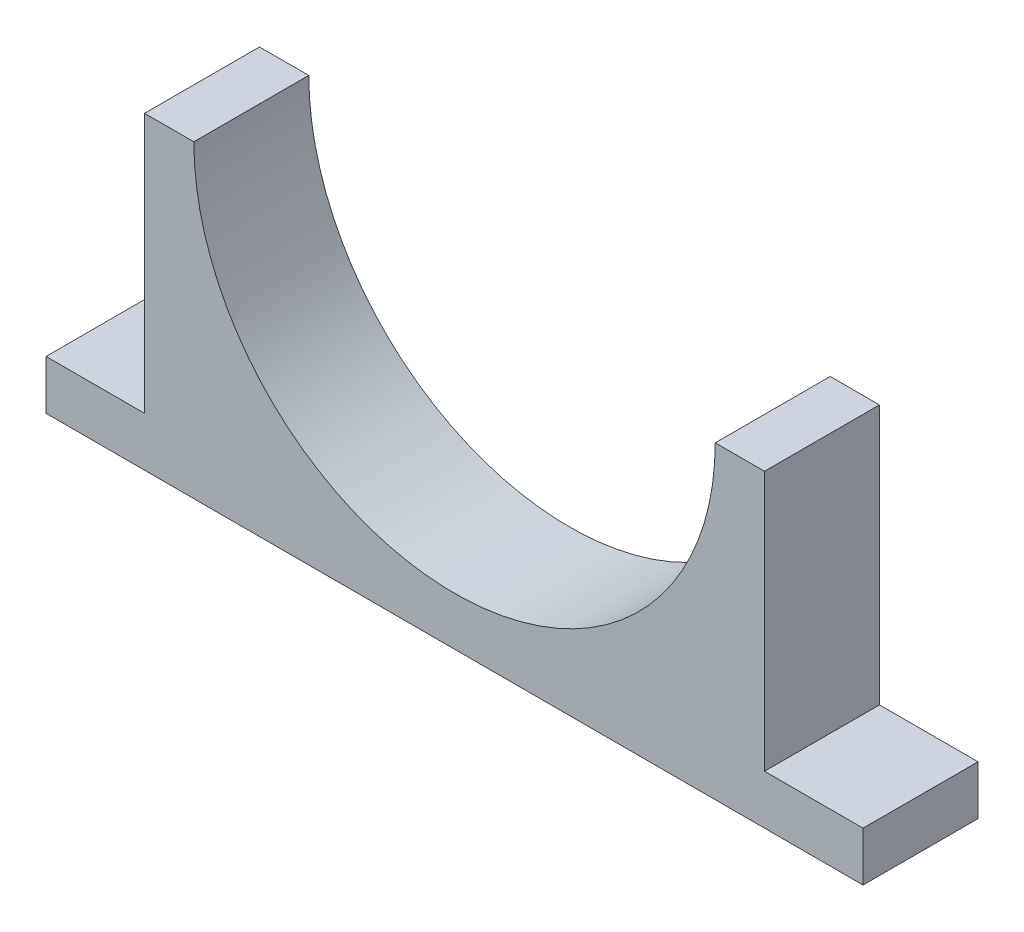
ISO-10303-21;
HEADER;
FILE_DESCRIPTION(('STEP AP214'),'2;1');
FILE_NAME('part.step','',(''),(''),'','','');
FILE_SCHEMA(('AUTOMOTIVE_DESIGN { 1 0 10303 214 1 1 1 1 }'));
ENDSEC;
DATA;
#1=APPLICATION_CONTEXT('core data for automotive mechanical design processes');
#2=APPLICATION_PROTOCOL_DEFINITION('international standard','automotive_design',2000,#1);
#3=PRODUCT_CONTEXT('',#1,'mechanical');
#4=PRODUCT('Part','Part','',(#3));
#5=PRODUCT_RELATED_PRODUCT_CATEGORY('part','',(#4));
#6=PRODUCT_DEFINITION_FORMATION('','',#4);
#7=PRODUCT_DEFINITION_CONTEXT('part definition',#1,'design');
#8=PRODUCT_DEFINITION('design','',#6,#7);
#9=PRODUCT_DEFINITION_SHAPE('','',#8);
#10=(LENGTH_UNIT() NAMED_UNIT(*) SI_UNIT(.MILLI.,.METRE.));
#11=(NAMED_UNIT(*) PLANE_ANGLE_UNIT() SI_UNIT($,.RADIAN.));
#12=(NAMED_UNIT(*) SI_UNIT($,.STERADIAN.) SOLID_ANGLE_UNIT());
#13=UNCERTAINTY_MEASURE_WITH_UNIT(LENGTH_MEASURE(1.E-05),#10,'distance_accuracy_value','');
#14=(GEOMETRIC_REPRESENTATION_CONTEXT(3) GLOBAL_UNCERTAINTY_ASSIGNED_CONTEXT((#13)) GLOBAL_UNIT_ASSIGNED_CONTEXT((#10,
#11,#12)) REPRESENTATION_CONTEXT('',''));
#15=CARTESIAN_POINT('',(0.,0.,0.));
#16=DIRECTION('',(0.,0.,1.));
#17=DIRECTION('',(1.,0.,0.));
#18=AXIS2_PLACEMENT_3D('',#15,#16,#17);
#19=CARTESIAN_POINT('',(0.,0.,7.));
#20=DIRECTION('',(0.,0.,-1.));
#21=DIRECTION('',(-1.,0.,0.));
#22=AXIS2_PLACEMENT_3D('',#19,#20,#21);
#23=CYLINDRICAL_SURFACE('',#22,15.875);
#24=CARTESIAN_POINT('',(0.,0.,0.));
#25=DIRECTION('',(0.,0.,-1.));
#26=DIRECTION('',(1.,0.,0.));
#27=AXIS2_PLACEMENT_3D('',#24,#25,#26);
#28=CIRCLE('',#27,15.875);
#29=CARTESIAN_POINT('',(15.875,0.,0.));
#30=VERTEX_POINT('',#29);
#31=CARTESIAN_POINT('',(-15.875,0.,0.));
#32=VERTEX_POINT('',#31);
#33=EDGE_CURVE('E141',#30,#32,#28,.T.);
#34=ORIENTED_EDGE('',*,*,#33,.T.);
#35=DIRECTION('',(0.,0.,-1.));
#36=VECTOR('',#35,1.);
#37=CARTESIAN_POINT('',(-15.875,0.,7.));
#38=LINE('',#37,#36);
#39=CARTESIAN_POINT('',(-15.875,0.,7.));
#40=VERTEX_POINT('',#39);
#41=EDGE_CURVE('E11',#40,#32,#38,.T.);
#42=ORIENTED_EDGE('',*,*,#41,.F.);
#43=CARTESIAN_POINT('',(0.,0.,7.));
#44=DIRECTION('',(0.,0.,-1.));
#45=DIRECTION('',(1.,0.,0.));
#46=AXIS2_PLACEMENT_3D('',#43,#44,#45);
#47=CIRCLE('',#46,15.875);
#48=CARTESIAN_POINT('',(15.875,0.,7.));
#49=VERTEX_POINT('',#48);
#50=EDGE_CURVE('E159',#49,#40,#47,.T.);
#51=ORIENTED_EDGE('',*,*,#50,.F.);
#52=DIRECTION('',(0.,0.,-1.));
#53=VECTOR('',#52,1.);
#54=CARTESIAN_POINT('',(15.875,0.,7.));
#55=LINE('',#54,#53);
#56=EDGE_CURVE('E137',#49,#30,#55,.T.);
#57=ORIENTED_EDGE('',*,*,#56,.T.);
#58=EDGE_LOOP('',(#34,#42,#51,#57));
#59=FACE_BOUND('',#58,.T.);
#60=ADVANCED_FACE('F33',(#59),#23,.F.);
#61=CARTESIAN_POINT('',(-15.875,0.,7.));
#62=DIRECTION('',(0.,-1.,0.));
#63=DIRECTION('',(1.,0.,0.));
#64=AXIS2_PLACEMENT_3D('',#61,#62,#63);
#65=PLANE('',#64);
#66=DIRECTION('',(-1.,0.,0.));
#67=VECTOR('',#66,1.);
#68=CARTESIAN_POINT('',(-15.875,0.,0.));
#69=LINE('',#68,#67);
#70=CARTESIAN_POINT('',(-18.875,0.,0.));
#71=VERTEX_POINT('',#70);
#72=EDGE_CURVE('E144',#32,#71,#69,.T.);
#73=ORIENTED_EDGE('',*,*,#72,.T.);
#74=DIRECTION('',(0.,0.,-1.));
#75=VECTOR('',#74,1.);
#76=CARTESIAN_POINT('',(-18.875,0.,7.));
#77=LINE('',#76,#75);
#78=CARTESIAN_POINT('',(-18.875,0.,7.));
#79=VERTEX_POINT('',#78);
#80=EDGE_CURVE('E41',#79,#71,#77,.T.);
#81=ORIENTED_EDGE('',*,*,#80,.F.);
#82=DIRECTION('',(-1.,0.,0.));
#83=VECTOR('',#82,1.);
#84=CARTESIAN_POINT('',(-15.875,0.,7.));
#85=LINE('',#84,#83);
#86=EDGE_CURVE('E98',#40,#79,#85,.T.);
#87=ORIENTED_EDGE('',*,*,#86,.F.);
#88=ORIENTED_EDGE('',*,*,#41,.T.);
#89=EDGE_LOOP('',(#73,#81,#87,#88));
#90=FACE_BOUND('',#89,.T.);
#91=ADVANCED_FACE('F208',(#90),#65,.F.);
#92=CARTESIAN_POINT('',(-18.875,0.,7.));
#93=DIRECTION('',(1.,0.,0.));
#94=DIRECTION('',(0.,1.,0.));
#95=AXIS2_PLACEMENT_3D('',#92,#93,#94);
#96=PLANE('',#95);
#97=DIRECTION('',(0.,-1.,0.));
#98=VECTOR('',#97,1.);
#99=CARTESIAN_POINT('',(-18.875,0.,0.));
#100=LINE('',#99,#98);
#101=CARTESIAN_POINT('',(-18.875,-15.82,0.));
#102=VERTEX_POINT('',#101);
#103=EDGE_CURVE('E146',#71,#102,#100,.T.);
#104=ORIENTED_EDGE('',*,*,#103,.T.);
#105=DIRECTION('',(0.,0.,-1.));
#106=VECTOR('',#105,1.);
#107=CARTESIAN_POINT('',(-18.875,-15.82,7.));
#108=LINE('',#107,#106);
#109=CARTESIAN_POINT('',(-18.875,-15.82,7.));
#110=VERTEX_POINT('',#109);
#111=EDGE_CURVE('E172',#110,#102,#108,.T.);
#112=ORIENTED_EDGE('',*,*,#111,.F.);
#113=DIRECTION('',(0.,-1.,0.));
#114=VECTOR('',#113,1.);
#115=CARTESIAN_POINT('',(-18.875,0.,7.));
#116=LINE('',#115,#114);
#117=EDGE_CURVE('E180',#79,#110,#116,.T.);
#118=ORIENTED_EDGE('',*,*,#117,.F.);
#119=ORIENTED_EDGE('',*,*,#80,.T.);
#120=EDGE_LOOP('',(#104,#112,#118,#119));
#121=FACE_BOUND('',#120,.T.);
#122=ADVANCED_FACE('F178',(#121),#96,.F.);
#123=CARTESIAN_POINT('',(-18.875,-15.82,7.));
#124=DIRECTION('',(0.,-1.,0.));
#125=DIRECTION('',(0.,0.,-1.));
#126=AXIS2_PLACEMENT_3D('',#123,#124,#125);
#127=PLANE('',#126);
#128=DIRECTION('',(-1.,0.,0.));
#129=VECTOR('',#128,1.);
#130=CARTESIAN_POINT('',(-18.875,-15.82,0.));
#131=LINE('',#130,#129);
#132=CARTESIAN_POINT('',(-24.875,-15.82,0.));
#133=VERTEX_POINT('',#132);
#134=EDGE_CURVE('E148',#102,#133,#131,.T.);
#135=ORIENTED_EDGE('',*,*,#134,.T.);
#136=DIRECTION('',(0.,0.,-1.));
#137=VECTOR('',#136,1.);
#138=CARTESIAN_POINT('',(-24.875,-15.82,7.));
#139=LINE('',#138,#137);
#140=CARTESIAN_POINT('',(-24.875,-15.82,7.));
#141=VERTEX_POINT('',#140);
#142=EDGE_CURVE('E169',#141,#133,#139,.T.);
#143=ORIENTED_EDGE('',*,*,#142,.F.);
#144=DIRECTION('',(-1.,0.,0.));
#145=VECTOR('',#144,1.);
#146=CARTESIAN_POINT('',(-18.875,-15.82,7.));
#147=LINE('',#146,#145);
#148=EDGE_CURVE('E198',#110,#141,#147,.T.);
#149=ORIENTED_EDGE('',*,*,#148,.F.);
#150=ORIENTED_EDGE('',*,*,#111,.T.);
#151=EDGE_LOOP('',(#135,#143,#149,#150));
#152=FACE_BOUND('',#151,.T.);
#153=ADVANCED_FACE('F189',(#152),#127,.F.);
#154=CARTESIAN_POINT('',(-24.875,-15.82,7.));
#155=DIRECTION('',(1.,0.,0.));
#156=DIRECTION('',(0.,0.,-1.));
#157=AXIS2_PLACEMENT_3D('',#154,#155,#156);
#158=PLANE('',#157);
#159=DIRECTION('',(0.,-1.,0.));
#160=VECTOR('',#159,1.);
#161=CARTESIAN_POINT('',(-24.875,-15.82,0.));
#162=LINE('',#161,#160);
#163=CARTESIAN_POINT('',(-24.875,-18.82,0.));
#164=VERTEX_POINT('',#163);
#165=EDGE_CURVE('E150',#133,#164,#162,.T.);
#166=ORIENTED_EDGE('',*,*,#165,.T.);
#167=DIRECTION('',(0.,0.,-1.));
#168=VECTOR('',#167,1.);
#169=CARTESIAN_POINT('',(-24.875,-18.82,7.));
#170=LINE('',#169,#168);
#171=CARTESIAN_POINT('',(-24.875,-18.82,7.));
#172=VERTEX_POINT('',#171);
#173=EDGE_CURVE('E166',#172,#164,#170,.T.);
#174=ORIENTED_EDGE('',*,*,#173,.F.);
#175=DIRECTION('',(0.,-1.,0.));
#176=VECTOR('',#175,1.);
#177=CARTESIAN_POINT('',(-24.875,-15.82,7.));
#178=LINE('',#177,#176);
#179=EDGE_CURVE('E195',#141,#172,#178,.T.);
#180=ORIENTED_EDGE('',*,*,#179,.F.);
#181=ORIENTED_EDGE('',*,*,#142,.T.);
#182=EDGE_LOOP('',(#166,#174,#180,#181));
#183=FACE_BOUND('',#182,.T.);
#184=ADVANCED_FACE('F193',(#183),#158,.F.);
#185=CARTESIAN_POINT('',(-24.875,-18.82,7.));
#186=DIRECTION('',(0.,1.,0.));
#187=DIRECTION('',(0.,0.,1.));
#188=AXIS2_PLACEMENT_3D('',#185,#186,#187);
#189=PLANE('',#188);
#190=DIRECTION('',(1.,0.,0.));
#191=VECTOR('',#190,1.);
#192=CARTESIAN_POINT('',(-24.875,-18.82,0.));
#193=LINE('',#192,#191);
#194=CARTESIAN_POINT('',(24.875,-18.82,0.));
#195=VERTEX_POINT('',#194);
#196=EDGE_CURVE('E152',#164,#195,#193,.T.);
#197=ORIENTED_EDGE('',*,*,#196,.T.);
#198=DIRECTION('',(0.,0.,-1.));
#199=VECTOR('',#198,1.);
#200=CARTESIAN_POINT('',(24.875,-18.82,7.));
#201=LINE('',#200,#199);
#202=CARTESIAN_POINT('',(24.875,-18.82,7.));
#203=VERTEX_POINT('',#202);
#204=EDGE_CURVE('E163',#203,#195,#201,.T.);
#205=ORIENTED_EDGE('',*,*,#204,.F.);
#206=DIRECTION('',(1.,0.,0.));
#207=VECTOR('',#206,1.);
#208=CARTESIAN_POINT('',(-24.875,-18.82,7.));
#209=LINE('',#208,#207);
#210=EDGE_CURVE('E197',#172,#203,#209,.T.);
#211=ORIENTED_EDGE('',*,*,#210,.F.);
#212=ORIENTED_EDGE('',*,*,#173,.T.);
#213=EDGE_LOOP('',(#197,#205,#211,#212));
#214=FACE_BOUND('',#213,.T.);
#215=ADVANCED_FACE('F220',(#214),#189,.F.);
#216=CARTESIAN_POINT('',(24.875,-18.82,7.));
#217=DIRECTION('',(-1.,0.,0.));
#218=DIRECTION('',(0.,0.,1.));
#219=AXIS2_PLACEMENT_3D('',#216,#217,#218);
#220=PLANE('',#219);
#221=DIRECTION('',(0.,1.,0.));
#222=VECTOR('',#221,1.);
#223=CARTESIAN_POINT('',(24.875,-18.82,0.));
#224=LINE('',#223,#222);
#225=CARTESIAN_POINT('',(24.875,-15.82,0.));
#226=VERTEX_POINT('',#225);
#227=EDGE_CURVE('E154',#195,#226,#224,.T.);
#228=ORIENTED_EDGE('',*,*,#227,.T.);
#229=DIRECTION('',(0.,0.,-1.));
#230=VECTOR('',#229,1.);
#231=CARTESIAN_POINT('',(24.875,-15.82,7.));
#232=LINE('',#231,#230);
#233=CARTESIAN_POINT('',(24.875,-15.82,7.));
#234=VERTEX_POINT('',#233);
#235=EDGE_CURVE('E132',#234,#226,#232,.T.);
#236=ORIENTED_EDGE('',*,*,#235,.F.);
#237=DIRECTION('',(0.,1.,0.));
#238=VECTOR('',#237,1.);
#239=CARTESIAN_POINT('',(24.875,-18.82,7.));
#240=LINE('',#239,#238);
#241=EDGE_CURVE('E123',#203,#234,#240,.T.);
#242=ORIENTED_EDGE('',*,*,#241,.F.);
#243=ORIENTED_EDGE('',*,*,#204,.T.);
#244=EDGE_LOOP('',(#228,#236,#242,#243));
#245=FACE_BOUND('',#244,.T.);
#246=ADVANCED_FACE('F223',(#245),#220,.F.);
#247=CARTESIAN_POINT('',(24.875,-15.82,7.));
#248=DIRECTION('',(0.,-1.,0.));
#249=DIRECTION('',(0.,0.,-1.));
#250=AXIS2_PLACEMENT_3D('',#247,#248,#249);
#251=PLANE('',#250);
#252=DIRECTION('',(-1.,0.,0.));
#253=VECTOR('',#252,1.);
#254=CARTESIAN_POINT('',(24.875,-15.82,0.));
#255=LINE('',#254,#253);
#256=CARTESIAN_POINT('',(18.875,-15.82,0.));
#257=VERTEX_POINT('',#256);
#258=EDGE_CURVE('E131',#226,#257,#255,.T.);
#259=ORIENTED_EDGE('',*,*,#258,.T.);
#260=DIRECTION('',(0.,0.,-1.));
#261=VECTOR('',#260,1.);
#262=CARTESIAN_POINT('',(18.875,-15.82,7.));
#263=LINE('',#262,#261);
#264=CARTESIAN_POINT('',(18.875,-15.82,7.));
#265=VERTEX_POINT('',#264);
#266=EDGE_CURVE('E128',#265,#257,#263,.T.);
#267=ORIENTED_EDGE('',*,*,#266,.F.);
#268=DIRECTION('',(-1.,0.,0.));
#269=VECTOR('',#268,1.);
#270=CARTESIAN_POINT('',(24.875,-15.82,7.));
#271=LINE('',#270,#269);
#272=EDGE_CURVE('E117',#234,#265,#271,.T.);
#273=ORIENTED_EDGE('',*,*,#272,.F.);
#274=ORIENTED_EDGE('',*,*,#235,.T.);
#275=EDGE_LOOP('',(#259,#267,#273,#274));
#276=FACE_BOUND('',#275,.T.);
#277=ADVANCED_FACE('F129',(#276),#251,.F.);
#278=CARTESIAN_POINT('',(18.875,-15.82,7.));
#279=DIRECTION('',(-1.,0.,0.));
#280=DIRECTION('',(0.,-1.,0.));
#281=AXIS2_PLACEMENT_3D('',#278,#279,#280);
#282=PLANE('',#281);
#283=DIRECTION('',(0.,1.,0.));
#284=VECTOR('',#283,1.);
#285=CARTESIAN_POINT('',(18.875,-15.82,0.));
#286=LINE('',#285,#284);
#287=CARTESIAN_POINT('',(18.875,0.,0.));
#288=VERTEX_POINT('',#287);
#289=EDGE_CURVE('E84',#257,#288,#286,.T.);
#290=ORIENTED_EDGE('',*,*,#289,.T.);
#291=DIRECTION('',(0.,0.,-1.));
#292=VECTOR('',#291,1.);
#293=CARTESIAN_POINT('',(18.875,0.,7.));
#294=LINE('',#293,#292);
#295=CARTESIAN_POINT('',(18.875,0.,7.));
#296=VERTEX_POINT('',#295);
#297=EDGE_CURVE('E133',#296,#288,#294,.T.);
#298=ORIENTED_EDGE('',*,*,#297,.F.);
#299=DIRECTION('',(0.,1.,0.));
#300=VECTOR('',#299,1.);
#301=CARTESIAN_POINT('',(18.875,-15.82,7.));
#302=LINE('',#301,#300);
#303=EDGE_CURVE('E121',#265,#296,#302,.T.);
#304=ORIENTED_EDGE('',*,*,#303,.F.);
#305=ORIENTED_EDGE('',*,*,#266,.T.);
#306=EDGE_LOOP('',(#290,#298,#304,#305));
#307=FACE_BOUND('',#306,.T.);
#308=ADVANCED_FACE('F135',(#307),#282,.F.);
#309=CARTESIAN_POINT('',(18.875,0.,7.));
#310=DIRECTION('',(0.,-1.,0.));
#311=DIRECTION('',(1.,0.,0.));
#312=AXIS2_PLACEMENT_3D('',#309,#310,#311);
#313=PLANE('',#312);
#314=DIRECTION('',(-1.,0.,0.));
#315=VECTOR('',#314,1.);
#316=CARTESIAN_POINT('',(18.875,0.,0.));
#317=LINE('',#316,#315);
#318=EDGE_CURVE('E90',#288,#30,#317,.T.);
#319=ORIENTED_EDGE('',*,*,#318,.T.);
#320=ORIENTED_EDGE('',*,*,#56,.F.);
#321=DIRECTION('',(-1.,0.,0.));
#322=VECTOR('',#321,1.);
#323=CARTESIAN_POINT('',(18.875,0.,7.));
#324=LINE('',#323,#322);
#325=EDGE_CURVE('E49',#296,#49,#324,.T.);
#326=ORIENTED_EDGE('',*,*,#325,.F.);
#327=ORIENTED_EDGE('',*,*,#297,.T.);
#328=EDGE_LOOP('',(#319,#320,#326,#327));
#329=FACE_BOUND('',#328,.T.);
#330=ADVANCED_FACE('F232',(#329),#313,.F.);
#331=CARTESIAN_POINT('',(0.,0.,7.));
#332=DIRECTION('',(0.,0.,1.));
#333=DIRECTION('',(1.,0.,0.));
#334=AXIS2_PLACEMENT_3D('',#331,#332,#333);
#335=PLANE('',#334);
#336=ORIENTED_EDGE('',*,*,#50,.T.);
#337=ORIENTED_EDGE('',*,*,#86,.T.);
#338=ORIENTED_EDGE('',*,*,#117,.T.);
#339=ORIENTED_EDGE('',*,*,#148,.T.);
#340=ORIENTED_EDGE('',*,*,#179,.T.);
#341=ORIENTED_EDGE('',*,*,#210,.T.);
#342=ORIENTED_EDGE('',*,*,#241,.T.);
#343=ORIENTED_EDGE('',*,*,#272,.T.);
#344=ORIENTED_EDGE('',*,*,#303,.T.);
#345=ORIENTED_EDGE('',*,*,#325,.T.);
#346=EDGE_LOOP('',(#336,#337,#338,#339,#340,#341,#342,#343,#344,#345));
#347=FACE_BOUND('',#346,.T.);
#348=ADVANCED_FACE('F119',(#347),#335,.T.);
#349=CARTESIAN_POINT('',(0.,0.,0.));
#350=DIRECTION('',(0.,0.,1.));
#351=DIRECTION('',(1.,0.,0.));
#352=AXIS2_PLACEMENT_3D('',#349,#350,#351);
#353=PLANE('',#352);
#354=ORIENTED_EDGE('',*,*,#33,.F.);
#355=ORIENTED_EDGE('',*,*,#318,.F.);
#356=ORIENTED_EDGE('',*,*,#289,.F.);
#357=ORIENTED_EDGE('',*,*,#258,.F.);
#358=ORIENTED_EDGE('',*,*,#227,.F.);
#359=ORIENTED_EDGE('',*,*,#196,.F.);
#360=ORIENTED_EDGE('',*,*,#165,.F.);
#361=ORIENTED_EDGE('',*,*,#134,.F.);
#362=ORIENTED_EDGE('',*,*,#103,.F.);
#363=ORIENTED_EDGE('',*,*,#72,.F.);
#364=EDGE_LOOP('',(#354,#355,#356,#357,#358,#359,#360,#361,#362,#363));
#365=FACE_BOUND('',#364,.T.);
#366=ADVANCED_FACE('F184',(#365),#353,.F.);
#367=CLOSED_SHELL('',(#60,#91,#122,#153,#184,#215,#246,#277,#308,#330,#348,#366));
#368=MANIFOLD_SOLID_BREP('B2',#367);
#369=ADVANCED_BREP_SHAPE_REPRESENTATION('',(#18,#368),#14);
#370=SHAPE_DEFINITION_REPRESENTATION(#9,#369);
ENDSEC;
END-ISO-10303-21;
